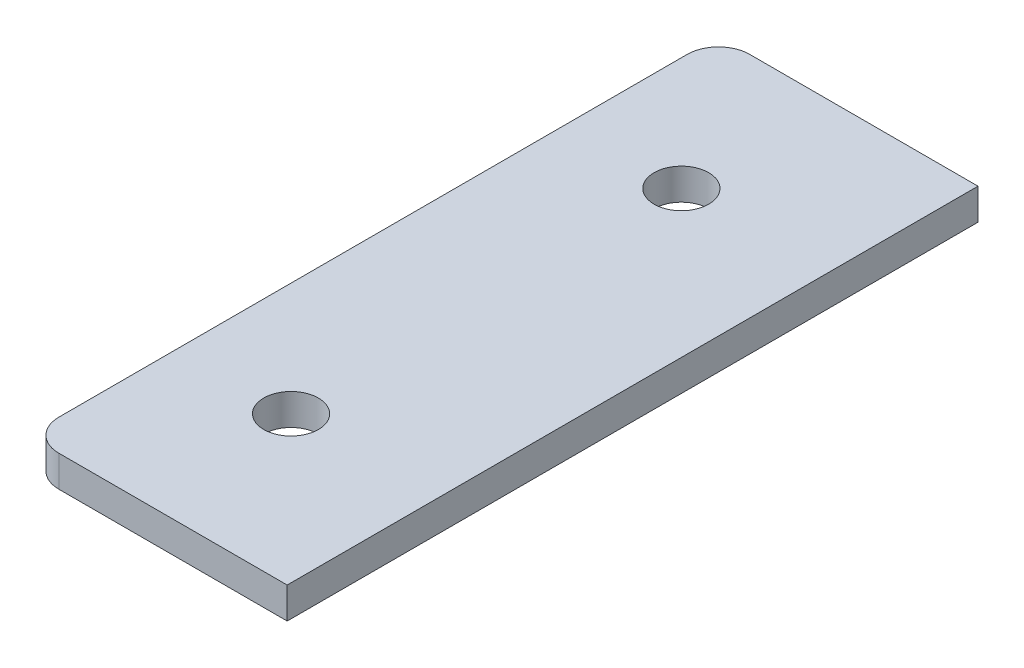
ISO-10303-21;
HEADER;
FILE_DESCRIPTION(('STEP AP214'),'2;1');
FILE_NAME('part.step','',(''),(''),'','','');
FILE_SCHEMA(('AUTOMOTIVE_DESIGN { 1 0 10303 214 1 1 1 1 }'));
ENDSEC;
DATA;
#1=APPLICATION_CONTEXT('core data for automotive mechanical design processes');
#2=APPLICATION_PROTOCOL_DEFINITION('international standard','automotive_design',2000,#1);
#3=PRODUCT_CONTEXT('',#1,'mechanical');
#4=PRODUCT('Part','Part','',(#3));
#5=PRODUCT_RELATED_PRODUCT_CATEGORY('part','',(#4));
#6=PRODUCT_DEFINITION_FORMATION('','',#4);
#7=PRODUCT_DEFINITION_CONTEXT('part definition',#1,'design');
#8=PRODUCT_DEFINITION('design','',#6,#7);
#9=PRODUCT_DEFINITION_SHAPE('','',#8);
#10=(LENGTH_UNIT() NAMED_UNIT(*) SI_UNIT(.MILLI.,.METRE.));
#11=(NAMED_UNIT(*) PLANE_ANGLE_UNIT() SI_UNIT($,.RADIAN.));
#12=(NAMED_UNIT(*) SI_UNIT($,.STERADIAN.) SOLID_ANGLE_UNIT());
#13=UNCERTAINTY_MEASURE_WITH_UNIT(LENGTH_MEASURE(1.E-05),#10,'distance_accuracy_value','');
#14=(GEOMETRIC_REPRESENTATION_CONTEXT(3) GLOBAL_UNCERTAINTY_ASSIGNED_CONTEXT((#13)) GLOBAL_UNIT_ASSIGNED_CONTEXT((#10,
#11,#12)) REPRESENTATION_CONTEXT('',''));
#15=CARTESIAN_POINT('',(0.,0.,0.));
#16=DIRECTION('',(0.,0.,1.));
#17=DIRECTION('',(1.,0.,0.));
#18=AXIS2_PLACEMENT_3D('',#15,#16,#17);
#19=CARTESIAN_POINT('',(-13.2676217812266,8.,-74.321586230945));
#20=DIRECTION('',(0.,1.,0.));
#21=DIRECTION('',(0.,0.,1.));
#22=AXIS2_PLACEMENT_3D('',#19,#20,#21);
#23=PLANE('',#22);
#24=CARTESIAN_POINT('',(7.73237821877335,8.,56.178413769055));
#25=DIRECTION('',(0.,1.,0.));
#26=DIRECTION('',(0.,0.,1.));
#27=AXIS2_PLACEMENT_3D('',#24,#25,#26);
#28=CIRCLE('',#27,7.);
#29=CARTESIAN_POINT('',(7.73237821877335,8.,63.178413769055));
#30=VERTEX_POINT('',#29);
#31=EDGE_CURVE('E122',#30,#30,#28,.T.);
#32=ORIENTED_EDGE('',*,*,#31,.F.);
#33=EDGE_LOOP('',(#32));
#34=FACE_BOUND('',#33,.T.);
#35=DIRECTION('',(-1.,0.,0.));
#36=VECTOR('',#35,1.);
#37=CARTESIAN_POINT('',(45.2323782187733,8.,-82.321586230945));
#38=LINE('',#37,#36);
#39=CARTESIAN_POINT('',(45.2323782187733,8.,-82.321586230945));
#40=VERTEX_POINT('',#39);
#41=CARTESIAN_POINT('',(-13.2676217812266,8.,-82.321586230945));
#42=VERTEX_POINT('',#41);
#43=EDGE_CURVE('E129',#40,#42,#38,.T.);
#44=ORIENTED_EDGE('',*,*,#43,.T.);
#45=CARTESIAN_POINT('',(-13.2676217812266,8.,-74.321586230945));
#46=DIRECTION('',(0.,1.,0.));
#47=DIRECTION('',(0.,0.,1.));
#48=AXIS2_PLACEMENT_3D('',#45,#46,#47);
#49=CIRCLE('',#48,8.00000000000001);
#50=CARTESIAN_POINT('',(-21.2676217812266,8.,-74.3215862309449));
#51=VERTEX_POINT('',#50);
#52=EDGE_CURVE('E87',#42,#51,#49,.T.);
#53=ORIENTED_EDGE('',*,*,#52,.T.);
#54=DIRECTION('',(0.,0.,1.));
#55=VECTOR('',#54,1.);
#56=CARTESIAN_POINT('',(-21.2676217812266,8.,-74.3215862309449));
#57=LINE('',#56,#55);
#58=CARTESIAN_POINT('',(-21.2676217812266,8.,86.678413769055));
#59=VERTEX_POINT('',#58);
#60=EDGE_CURVE('E100',#51,#59,#57,.T.);
#61=ORIENTED_EDGE('',*,*,#60,.T.);
#62=CARTESIAN_POINT('',(-13.2676217812266,8.,86.6784137690551));
#63=DIRECTION('',(0.,1.,0.));
#64=DIRECTION('',(0.,0.,1.));
#65=AXIS2_PLACEMENT_3D('',#62,#63,#64);
#66=CIRCLE('',#65,8.);
#67=CARTESIAN_POINT('',(-13.2676217812266,8.,94.678413769055));
#68=VERTEX_POINT('',#67);
#69=EDGE_CURVE('E94',#59,#68,#66,.T.);
#70=ORIENTED_EDGE('',*,*,#69,.T.);
#71=DIRECTION('',(1.,0.,0.));
#72=VECTOR('',#71,1.);
#73=CARTESIAN_POINT('',(-13.2676217812266,8.,94.678413769055));
#74=LINE('',#73,#72);
#75=CARTESIAN_POINT('',(45.2323782187733,8.,94.678413769055));
#76=VERTEX_POINT('',#75);
#77=EDGE_CURVE('E98',#68,#76,#74,.T.);
#78=ORIENTED_EDGE('',*,*,#77,.T.);
#79=DIRECTION('',(0.,0.,-1.));
#80=VECTOR('',#79,1.);
#81=CARTESIAN_POINT('',(45.2323782187733,8.,-82.321586230945));
#82=LINE('',#81,#80);
#83=EDGE_CURVE('E50',#76,#40,#82,.T.);
#84=ORIENTED_EDGE('',*,*,#83,.T.);
#85=EDGE_LOOP('',(#44,#53,#61,#70,#78,#84));
#86=FACE_BOUND('',#85,.T.);
#87=CARTESIAN_POINT('',(7.73237821877336,8.,-43.821586230945));
#88=DIRECTION('',(0.,1.,0.));
#89=DIRECTION('',(0.,0.,1.));
#90=AXIS2_PLACEMENT_3D('',#87,#88,#89);
#91=CIRCLE('',#90,7.);
#92=CARTESIAN_POINT('',(7.73237821877336,8.,-36.821586230945));
#93=VERTEX_POINT('',#92);
#94=EDGE_CURVE('E171',#93,#93,#91,.T.);
#95=ORIENTED_EDGE('',*,*,#94,.F.);
#96=EDGE_LOOP('',(#95));
#97=FACE_BOUND('',#96,.T.);
#98=ADVANCED_FACE('F33',(#34,#86,#97),#23,.T.);
#99=CARTESIAN_POINT('',(-13.2676217812266,0.,-74.321586230945));
#100=DIRECTION('',(0.,1.,0.));
#101=DIRECTION('',(0.,0.,1.));
#102=AXIS2_PLACEMENT_3D('',#99,#100,#101);
#103=PLANE('',#102);
#104=DIRECTION('',(-1.,0.,0.));
#105=VECTOR('',#104,1.);
#106=CARTESIAN_POINT('',(45.2323782187733,0.,-82.321586230945));
#107=LINE('',#106,#105);
#108=CARTESIAN_POINT('',(45.2323782187733,0.,-82.321586230945));
#109=VERTEX_POINT('',#108);
#110=CARTESIAN_POINT('',(-13.2676217812266,0.,-82.321586230945));
#111=VERTEX_POINT('',#110);
#112=EDGE_CURVE('E118',#109,#111,#107,.T.);
#113=ORIENTED_EDGE('',*,*,#112,.F.);
#114=DIRECTION('',(0.,0.,-1.));
#115=VECTOR('',#114,1.);
#116=CARTESIAN_POINT('',(45.2323782187733,0.,-82.321586230945));
#117=LINE('',#116,#115);
#118=CARTESIAN_POINT('',(45.2323782187733,0.,94.678413769055));
#119=VERTEX_POINT('',#118);
#120=EDGE_CURVE('E79',#119,#109,#117,.T.);
#121=ORIENTED_EDGE('',*,*,#120,.F.);
#122=DIRECTION('',(1.,0.,0.));
#123=VECTOR('',#122,1.);
#124=CARTESIAN_POINT('',(-13.2676217812266,0.,94.678413769055));
#125=LINE('',#124,#123);
#126=CARTESIAN_POINT('',(-13.2676217812266,0.,94.678413769055));
#127=VERTEX_POINT('',#126);
#128=EDGE_CURVE('E73',#127,#119,#125,.T.);
#129=ORIENTED_EDGE('',*,*,#128,.F.);
#130=CARTESIAN_POINT('',(-13.2676217812266,0.,86.6784137690551));
#131=DIRECTION('',(0.,1.,0.));
#132=DIRECTION('',(0.,0.,1.));
#133=AXIS2_PLACEMENT_3D('',#130,#131,#132);
#134=CIRCLE('',#133,8.);
#135=CARTESIAN_POINT('',(-21.2676217812266,0.,86.678413769055));
#136=VERTEX_POINT('',#135);
#137=EDGE_CURVE('E108',#136,#127,#134,.T.);
#138=ORIENTED_EDGE('',*,*,#137,.F.);
#139=DIRECTION('',(0.,0.,1.));
#140=VECTOR('',#139,1.);
#141=CARTESIAN_POINT('',(-21.2676217812266,0.,-74.3215862309449));
#142=LINE('',#141,#140);
#143=CARTESIAN_POINT('',(-21.2676217812266,0.,-74.3215862309449));
#144=VERTEX_POINT('',#143);
#145=EDGE_CURVE('E124',#144,#136,#142,.T.);
#146=ORIENTED_EDGE('',*,*,#145,.F.);
#147=CARTESIAN_POINT('',(-13.2676217812266,0.,-74.321586230945));
#148=DIRECTION('',(0.,1.,0.));
#149=DIRECTION('',(0.,0.,1.));
#150=AXIS2_PLACEMENT_3D('',#147,#148,#149);
#151=CIRCLE('',#150,8.00000000000001);
#152=EDGE_CURVE('E121',#111,#144,#151,.T.);
#153=ORIENTED_EDGE('',*,*,#152,.F.);
#154=EDGE_LOOP('',(#113,#121,#129,#138,#146,#153));
#155=FACE_BOUND('',#154,.T.);
#156=CARTESIAN_POINT('',(7.73237821877335,0.,56.178413769055));
#157=DIRECTION('',(0.,1.,0.));
#158=DIRECTION('',(0.,0.,1.));
#159=AXIS2_PLACEMENT_3D('',#156,#157,#158);
#160=CIRCLE('',#159,7.);
#161=CARTESIAN_POINT('',(7.73237821877335,0.,63.178413769055));
#162=VERTEX_POINT('',#161);
#163=EDGE_CURVE('E177',#162,#162,#160,.T.);
#164=ORIENTED_EDGE('',*,*,#163,.T.);
#165=EDGE_LOOP('',(#164));
#166=FACE_BOUND('',#165,.T.);
#167=CARTESIAN_POINT('',(7.73237821877336,0.,-43.821586230945));
#168=DIRECTION('',(0.,1.,0.));
#169=DIRECTION('',(0.,0.,1.));
#170=AXIS2_PLACEMENT_3D('',#167,#168,#169);
#171=CIRCLE('',#170,7.);
#172=CARTESIAN_POINT('',(7.73237821877336,0.,-36.821586230945));
#173=VERTEX_POINT('',#172);
#174=EDGE_CURVE('E174',#173,#173,#171,.T.);
#175=ORIENTED_EDGE('',*,*,#174,.T.);
#176=EDGE_LOOP('',(#175));
#177=FACE_BOUND('',#176,.T.);
#178=ADVANCED_FACE('F138',(#155,#166,#177),#103,.F.);
#179=CARTESIAN_POINT('',(45.2323782187733,8.,-82.321586230945));
#180=DIRECTION('',(0.,0.,1.));
#181=DIRECTION('',(1.,0.,0.));
#182=AXIS2_PLACEMENT_3D('',#179,#180,#181);
#183=PLANE('',#182);
#184=ORIENTED_EDGE('',*,*,#112,.T.);
#185=DIRECTION('',(0.,-1.,0.));
#186=VECTOR('',#185,1.);
#187=CARTESIAN_POINT('',(-13.2676217812266,8.,-82.321586230945));
#188=LINE('',#187,#186);
#189=EDGE_CURVE('E11',#42,#111,#188,.T.);
#190=ORIENTED_EDGE('',*,*,#189,.F.);
#191=ORIENTED_EDGE('',*,*,#43,.F.);
#192=DIRECTION('',(0.,-1.,0.));
#193=VECTOR('',#192,1.);
#194=CARTESIAN_POINT('',(45.2323782187733,8.,-82.321586230945));
#195=LINE('',#194,#193);
#196=EDGE_CURVE('E114',#40,#109,#195,.T.);
#197=ORIENTED_EDGE('',*,*,#196,.T.);
#198=EDGE_LOOP('',(#184,#190,#191,#197));
#199=FACE_BOUND('',#198,.T.);
#200=ADVANCED_FACE('F35',(#199),#183,.F.);
#201=CARTESIAN_POINT('',(-13.2676217812266,8.,-74.321586230945));
#202=DIRECTION('',(0.,-1.,0.));
#203=DIRECTION('',(0.,0.,-1.));
#204=AXIS2_PLACEMENT_3D('',#201,#202,#203);
#205=CYLINDRICAL_SURFACE('',#204,8.00000000000001);
#206=ORIENTED_EDGE('',*,*,#152,.T.);
#207=DIRECTION('',(0.,-1.,0.));
#208=VECTOR('',#207,1.);
#209=CARTESIAN_POINT('',(-21.2676217812266,8.,-74.3215862309449));
#210=LINE('',#209,#208);
#211=EDGE_CURVE('E42',#51,#144,#210,.T.);
#212=ORIENTED_EDGE('',*,*,#211,.F.);
#213=ORIENTED_EDGE('',*,*,#52,.F.);
#214=ORIENTED_EDGE('',*,*,#189,.T.);
#215=EDGE_LOOP('',(#206,#212,#213,#214));
#216=FACE_BOUND('',#215,.T.);
#217=ADVANCED_FACE('F218',(#216),#205,.T.);
#218=CARTESIAN_POINT('',(-21.2676217812266,8.,-74.3215862309449));
#219=DIRECTION('',(1.,0.,0.));
#220=DIRECTION('',(0.,0.,-1.));
#221=AXIS2_PLACEMENT_3D('',#218,#219,#220);
#222=PLANE('',#221);
#223=ORIENTED_EDGE('',*,*,#145,.T.);
#224=DIRECTION('',(0.,-1.,0.));
#225=VECTOR('',#224,1.);
#226=CARTESIAN_POINT('',(-21.2676217812266,8.,86.678413769055));
#227=LINE('',#226,#225);
#228=EDGE_CURVE('E109',#59,#136,#227,.T.);
#229=ORIENTED_EDGE('',*,*,#228,.F.);
#230=ORIENTED_EDGE('',*,*,#60,.F.);
#231=ORIENTED_EDGE('',*,*,#211,.T.);
#232=EDGE_LOOP('',(#223,#229,#230,#231));
#233=FACE_BOUND('',#232,.T.);
#234=ADVANCED_FACE('F135',(#233),#222,.F.);
#235=CARTESIAN_POINT('',(-13.2676217812266,8.,86.6784137690551));
#236=DIRECTION('',(0.,-1.,0.));
#237=DIRECTION('',(0.,0.,-1.));
#238=AXIS2_PLACEMENT_3D('',#235,#236,#237);
#239=CYLINDRICAL_SURFACE('',#238,8.);
#240=ORIENTED_EDGE('',*,*,#137,.T.);
#241=DIRECTION('',(0.,-1.,0.));
#242=VECTOR('',#241,1.);
#243=CARTESIAN_POINT('',(-13.2676217812266,8.,94.678413769055));
#244=LINE('',#243,#242);
#245=EDGE_CURVE('E105',#68,#127,#244,.T.);
#246=ORIENTED_EDGE('',*,*,#245,.F.);
#247=ORIENTED_EDGE('',*,*,#69,.F.);
#248=ORIENTED_EDGE('',*,*,#228,.T.);
#249=EDGE_LOOP('',(#240,#246,#247,#248));
#250=FACE_BOUND('',#249,.T.);
#251=ADVANCED_FACE('F106',(#250),#239,.T.);
#252=CARTESIAN_POINT('',(-13.2676217812266,8.,94.678413769055));
#253=DIRECTION('',(0.,0.,-1.));
#254=DIRECTION('',(-1.,0.,0.));
#255=AXIS2_PLACEMENT_3D('',#252,#253,#254);
#256=PLANE('',#255);
#257=ORIENTED_EDGE('',*,*,#128,.T.);
#258=DIRECTION('',(0.,-1.,0.));
#259=VECTOR('',#258,1.);
#260=CARTESIAN_POINT('',(45.2323782187733,8.,94.678413769055));
#261=LINE('',#260,#259);
#262=EDGE_CURVE('E110',#76,#119,#261,.T.);
#263=ORIENTED_EDGE('',*,*,#262,.F.);
#264=ORIENTED_EDGE('',*,*,#77,.F.);
#265=ORIENTED_EDGE('',*,*,#245,.T.);
#266=EDGE_LOOP('',(#257,#263,#264,#265));
#267=FACE_BOUND('',#266,.T.);
#268=ADVANCED_FACE('F112',(#267),#256,.F.);
#269=CARTESIAN_POINT('',(45.2323782187733,8.,-82.321586230945));
#270=DIRECTION('',(-1.,0.,0.));
#271=DIRECTION('',(0.,0.,1.));
#272=AXIS2_PLACEMENT_3D('',#269,#270,#271);
#273=PLANE('',#272);
#274=ORIENTED_EDGE('',*,*,#120,.T.);
#275=ORIENTED_EDGE('',*,*,#196,.F.);
#276=ORIENTED_EDGE('',*,*,#83,.F.);
#277=ORIENTED_EDGE('',*,*,#262,.T.);
#278=EDGE_LOOP('',(#274,#275,#276,#277));
#279=FACE_BOUND('',#278,.T.);
#280=ADVANCED_FACE('F143',(#279),#273,.F.);
#281=CARTESIAN_POINT('',(7.73237821877335,8.,56.178413769055));
#282=DIRECTION('',(0.,-1.,0.));
#283=DIRECTION('',(0.,0.,-1.));
#284=AXIS2_PLACEMENT_3D('',#281,#282,#283);
#285=CYLINDRICAL_SURFACE('',#284,7.);
#286=ORIENTED_EDGE('',*,*,#31,.T.);
#287=EDGE_LOOP('',(#286));
#288=FACE_BOUND('',#287,.T.);
#289=ORIENTED_EDGE('',*,*,#163,.F.);
#290=EDGE_LOOP('',(#289));
#291=FACE_BOUND('',#290,.T.);
#292=ADVANCED_FACE('F145',(#288,#291),#285,.F.);
#293=CARTESIAN_POINT('',(7.73237821877336,8.,-43.821586230945));
#294=DIRECTION('',(0.,-1.,0.));
#295=DIRECTION('',(0.,0.,-1.));
#296=AXIS2_PLACEMENT_3D('',#293,#294,#295);
#297=CYLINDRICAL_SURFACE('',#296,7.);
#298=ORIENTED_EDGE('',*,*,#94,.T.);
#299=EDGE_LOOP('',(#298));
#300=FACE_BOUND('',#299,.T.);
#301=ORIENTED_EDGE('',*,*,#174,.F.);
#302=EDGE_LOOP('',(#301));
#303=FACE_BOUND('',#302,.T.);
#304=ADVANCED_FACE('F151',(#300,#303),#297,.F.);
#305=CLOSED_SHELL('',(#98,#178,#200,#217,#234,#251,#268,#280,#292,#304));
#306=MANIFOLD_SOLID_BREP('B2',#305);
#307=ADVANCED_BREP_SHAPE_REPRESENTATION('',(#18,#306),#14);
#308=SHAPE_DEFINITION_REPRESENTATION(#9,#307);
ENDSEC;
END-ISO-10303-21;
